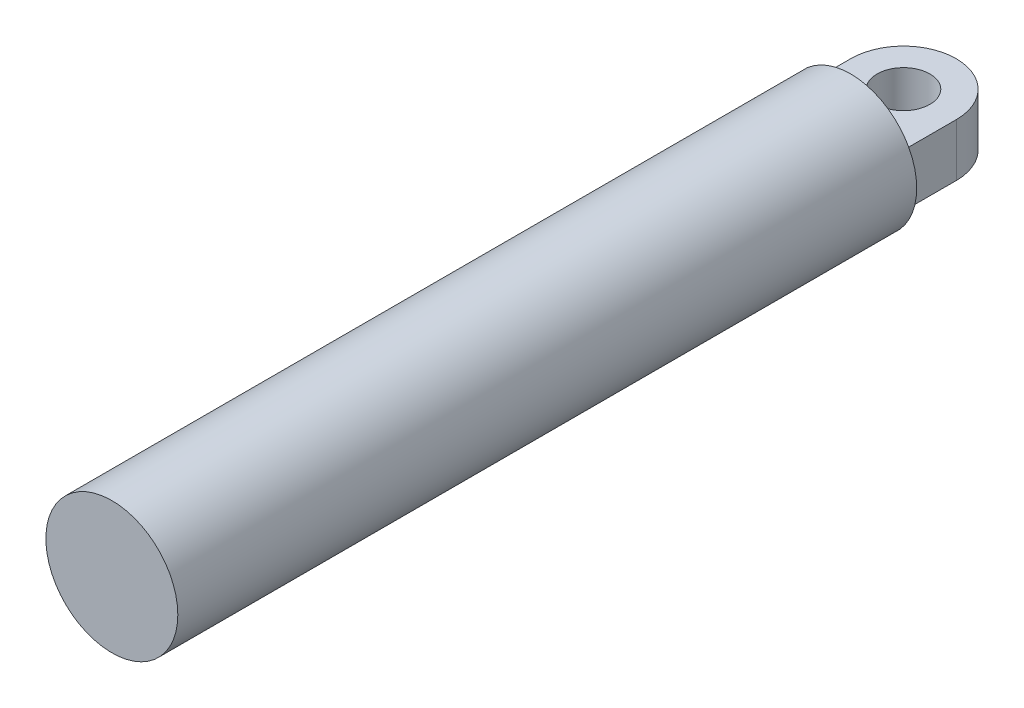
ISO-10303-21;
HEADER;
FILE_DESCRIPTION(('STEP AP214'),'2;1');
FILE_NAME('part.step','',(''),(''),'','','');
FILE_SCHEMA(('AUTOMOTIVE_DESIGN { 1 0 10303 214 1 1 1 1 }'));
ENDSEC;
DATA;
#1=APPLICATION_CONTEXT('core data for automotive mechanical design processes');
#2=APPLICATION_PROTOCOL_DEFINITION('international standard','automotive_design',2000,#1);
#3=PRODUCT_CONTEXT('',#1,'mechanical');
#4=PRODUCT('Part','Part','',(#3));
#5=PRODUCT_RELATED_PRODUCT_CATEGORY('part','',(#4));
#6=PRODUCT_DEFINITION_FORMATION('','',#4);
#7=PRODUCT_DEFINITION_CONTEXT('part definition',#1,'design');
#8=PRODUCT_DEFINITION('design','',#6,#7);
#9=PRODUCT_DEFINITION_SHAPE('','',#8);
#10=(LENGTH_UNIT() NAMED_UNIT(*) SI_UNIT(.MILLI.,.METRE.));
#11=(NAMED_UNIT(*) PLANE_ANGLE_UNIT() SI_UNIT($,.RADIAN.));
#12=(NAMED_UNIT(*) SI_UNIT($,.STERADIAN.) SOLID_ANGLE_UNIT());
#13=UNCERTAINTY_MEASURE_WITH_UNIT(LENGTH_MEASURE(1.E-05),#10,'distance_accuracy_value','');
#14=(GEOMETRIC_REPRESENTATION_CONTEXT(3) GLOBAL_UNCERTAINTY_ASSIGNED_CONTEXT((#13)) GLOBAL_UNIT_ASSIGNED_CONTEXT((#10,
#11,#12)) REPRESENTATION_CONTEXT('',''));
#15=CARTESIAN_POINT('',(0.,0.,0.));
#16=DIRECTION('',(0.,0.,1.));
#17=DIRECTION('',(1.,0.,0.));
#18=AXIS2_PLACEMENT_3D('',#15,#16,#17);
#19=CARTESIAN_POINT('',(0.,10.,-320.));
#20=DIRECTION('',(0.,1.,0.));
#21=DIRECTION('',(0.,0.,1.));
#22=AXIS2_PLACEMENT_3D('',#19,#20,#21);
#23=PLANE('',#22);
#24=CARTESIAN_POINT('',(0.,10.,-300.));
#25=DIRECTION('',(0.,1.,0.));
#26=DIRECTION('',(0.,0.,1.));
#27=AXIS2_PLACEMENT_3D('',#24,#25,#26);
#28=CIRCLE('',#27,10.);
#29=CARTESIAN_POINT('',(0.,10.,-290.));
#30=VERTEX_POINT('',#29);
#31=EDGE_CURVE('E185',#30,#30,#28,.T.);
#32=ORIENTED_EDGE('',*,*,#31,.F.);
#33=EDGE_LOOP('',(#32));
#34=FACE_BOUND('',#33,.T.);
#35=DIRECTION('',(0.,0.,1.));
#36=VECTOR('',#35,1.);
#37=CARTESIAN_POINT('',(20.,10.,-320.));
#38=LINE('',#37,#36);
#39=CARTESIAN_POINT('',(20.,10.,-300.));
#40=VERTEX_POINT('',#39);
#41=CARTESIAN_POINT('',(20.,10.,-280.));
#42=VERTEX_POINT('',#41);
#43=EDGE_CURVE('E140',#40,#42,#38,.T.);
#44=ORIENTED_EDGE('',*,*,#43,.F.);
#45=CARTESIAN_POINT('',(0.,10.,-300.));
#46=DIRECTION('',(0.,1.,0.));
#47=DIRECTION('',(0.,0.,1.));
#48=AXIS2_PLACEMENT_3D('',#45,#46,#47);
#49=CIRCLE('',#48,20.);
#50=CARTESIAN_POINT('',(-20.,10.,-300.));
#51=VERTEX_POINT('',#50);
#52=EDGE_CURVE('E129',#40,#51,#49,.T.);
#53=ORIENTED_EDGE('',*,*,#52,.T.);
#54=DIRECTION('',(0.,0.,1.));
#55=VECTOR('',#54,1.);
#56=CARTESIAN_POINT('',(-20.,10.,-320.));
#57=LINE('',#56,#55);
#58=CARTESIAN_POINT('',(-20.,10.,-280.));
#59=VERTEX_POINT('',#58);
#60=EDGE_CURVE('E94',#51,#59,#57,.T.);
#61=ORIENTED_EDGE('',*,*,#60,.T.);
#62=DIRECTION('',(-1.,0.,0.));
#63=VECTOR('',#62,1.);
#64=CARTESIAN_POINT('',(0.,10.,-280.));
#65=LINE('',#64,#63);
#66=EDGE_CURVE('E171',#42,#59,#65,.T.);
#67=ORIENTED_EDGE('',*,*,#66,.F.);
#68=EDGE_LOOP('',(#44,#53,#61,#67));
#69=FACE_BOUND('',#68,.T.);
#70=ADVANCED_FACE('F77',(#34,#69),#23,.T.);
#71=CARTESIAN_POINT('',(0.,-10.,-320.));
#72=DIRECTION('',(0.,1.,0.));
#73=DIRECTION('',(0.,0.,1.));
#74=AXIS2_PLACEMENT_3D('',#71,#72,#73);
#75=PLANE('',#74);
#76=CARTESIAN_POINT('',(0.,-10.,-300.));
#77=DIRECTION('',(0.,1.,0.));
#78=DIRECTION('',(0.,0.,1.));
#79=AXIS2_PLACEMENT_3D('',#76,#77,#78);
#80=CIRCLE('',#79,10.);
#81=CARTESIAN_POINT('',(0.,-10.,-290.));
#82=VERTEX_POINT('',#81);
#83=EDGE_CURVE('E81',#82,#82,#80,.T.);
#84=ORIENTED_EDGE('',*,*,#83,.T.);
#85=EDGE_LOOP('',(#84));
#86=FACE_BOUND('',#85,.T.);
#87=CARTESIAN_POINT('',(0.,-10.,-300.));
#88=DIRECTION('',(0.,1.,0.));
#89=DIRECTION('',(0.,0.,1.));
#90=AXIS2_PLACEMENT_3D('',#87,#88,#89);
#91=CIRCLE('',#90,20.);
#92=CARTESIAN_POINT('',(20.,-10.,-300.));
#93=VERTEX_POINT('',#92);
#94=CARTESIAN_POINT('',(-20.,-10.,-300.));
#95=VERTEX_POINT('',#94);
#96=EDGE_CURVE('E121',#93,#95,#91,.T.);
#97=ORIENTED_EDGE('',*,*,#96,.F.);
#98=DIRECTION('',(0.,0.,1.));
#99=VECTOR('',#98,1.);
#100=CARTESIAN_POINT('',(20.,-10.,-320.));
#101=LINE('',#100,#99);
#102=CARTESIAN_POINT('',(20.,-10.,-280.));
#103=VERTEX_POINT('',#102);
#104=EDGE_CURVE('E125',#93,#103,#101,.T.);
#105=ORIENTED_EDGE('',*,*,#104,.T.);
#106=DIRECTION('',(-1.,0.,0.));
#107=VECTOR('',#106,1.);
#108=CARTESIAN_POINT('',(0.,-10.,-280.));
#109=LINE('',#108,#107);
#110=CARTESIAN_POINT('',(-20.,-10.,-280.));
#111=VERTEX_POINT('',#110);
#112=EDGE_CURVE('E145',#103,#111,#109,.T.);
#113=ORIENTED_EDGE('',*,*,#112,.T.);
#114=DIRECTION('',(0.,0.,1.));
#115=VECTOR('',#114,1.);
#116=CARTESIAN_POINT('',(-20.,-10.,-320.));
#117=LINE('',#116,#115);
#118=EDGE_CURVE('E101',#95,#111,#117,.T.);
#119=ORIENTED_EDGE('',*,*,#118,.F.);
#120=EDGE_LOOP('',(#97,#105,#113,#119));
#121=FACE_BOUND('',#120,.T.);
#122=ADVANCED_FACE('F123',(#86,#121),#75,.F.);
#123=CARTESIAN_POINT('',(0.,0.,-280.));
#124=DIRECTION('',(0.,0.,-1.));
#125=DIRECTION('',(-1.,0.,0.));
#126=AXIS2_PLACEMENT_3D('',#123,#124,#125);
#127=PLANE('',#126);
#128=CARTESIAN_POINT('',(0.,0.,-280.));
#129=DIRECTION('',(0.,0.,-1.));
#130=DIRECTION('',(-1.,0.,0.));
#131=AXIS2_PLACEMENT_3D('',#128,#129,#130);
#132=CIRCLE('',#131,25.);
#133=CARTESIAN_POINT('',(-25.,0.,-280.));
#134=VERTEX_POINT('',#133);
#135=EDGE_CURVE('E151',#134,#134,#132,.T.);
#136=ORIENTED_EDGE('',*,*,#135,.T.);
#137=EDGE_LOOP('',(#136));
#138=FACE_BOUND('',#137,.T.);
#139=ORIENTED_EDGE('',*,*,#66,.T.);
#140=DIRECTION('',(0.,-1.,0.));
#141=VECTOR('',#140,1.);
#142=CARTESIAN_POINT('',(-20.,0.,-280.));
#143=LINE('',#142,#141);
#144=EDGE_CURVE('E172',#59,#111,#143,.T.);
#145=ORIENTED_EDGE('',*,*,#144,.T.);
#146=ORIENTED_EDGE('',*,*,#112,.F.);
#147=DIRECTION('',(0.,-1.,0.));
#148=VECTOR('',#147,1.);
#149=CARTESIAN_POINT('',(20.,0.,-280.));
#150=LINE('',#149,#148);
#151=EDGE_CURVE('E137',#42,#103,#150,.T.);
#152=ORIENTED_EDGE('',*,*,#151,.F.);
#153=EDGE_LOOP('',(#139,#145,#146,#152));
#154=FACE_BOUND('',#153,.T.);
#155=ADVANCED_FACE('F163',(#138,#154),#127,.T.);
#156=CARTESIAN_POINT('',(0.,0.,-30.));
#157=DIRECTION('',(0.,0.,1.));
#158=DIRECTION('',(1.,0.,0.));
#159=AXIS2_PLACEMENT_3D('',#156,#157,#158);
#160=CYLINDRICAL_SURFACE('',#159,25.);
#161=CARTESIAN_POINT('',(0.,0.,0.));
#162=DIRECTION('',(0.,0.,1.));
#163=DIRECTION('',(1.,0.,0.));
#164=AXIS2_PLACEMENT_3D('',#161,#162,#163);
#165=CIRCLE('',#164,25.);
#166=CARTESIAN_POINT('',(25.,0.,0.));
#167=VERTEX_POINT('',#166);
#168=EDGE_CURVE('E87',#167,#167,#165,.T.);
#169=ORIENTED_EDGE('',*,*,#168,.F.);
#170=EDGE_LOOP('',(#169));
#171=FACE_BOUND('',#170,.T.);
#172=ORIENTED_EDGE('',*,*,#135,.F.);
#173=EDGE_LOOP('',(#172));
#174=FACE_BOUND('',#173,.T.);
#175=ADVANCED_FACE('F79',(#171,#174),#160,.T.);
#176=CARTESIAN_POINT('',(0.,0.,0.));
#177=DIRECTION('',(0.,0.,1.));
#178=DIRECTION('',(1.,0.,0.));
#179=AXIS2_PLACEMENT_3D('',#176,#177,#178);
#180=PLANE('',#179);
#181=ORIENTED_EDGE('',*,*,#168,.T.);
#182=EDGE_LOOP('',(#181));
#183=FACE_BOUND('',#182,.T.);
#184=ADVANCED_FACE('F159',(#183),#180,.T.);
#185=CARTESIAN_POINT('',(-20.,0.,-320.));
#186=DIRECTION('',(-1.,0.,0.));
#187=DIRECTION('',(0.,0.,1.));
#188=AXIS2_PLACEMENT_3D('',#185,#186,#187);
#189=PLANE('',#188);
#190=DIRECTION('',(0.,1.,0.));
#191=VECTOR('',#190,1.);
#192=CARTESIAN_POINT('',(-20.,-25.,-300.));
#193=LINE('',#192,#191);
#194=EDGE_CURVE('E130',#95,#51,#193,.T.);
#195=ORIENTED_EDGE('',*,*,#194,.F.);
#196=ORIENTED_EDGE('',*,*,#118,.T.);
#197=ORIENTED_EDGE('',*,*,#144,.F.);
#198=ORIENTED_EDGE('',*,*,#60,.F.);
#199=EDGE_LOOP('',(#195,#196,#197,#198));
#200=FACE_BOUND('',#199,.T.);
#201=ADVANCED_FACE('F211',(#200),#189,.T.);
#202=CARTESIAN_POINT('',(20.,0.,-320.));
#203=DIRECTION('',(-1.,0.,0.));
#204=DIRECTION('',(0.,0.,1.));
#205=AXIS2_PLACEMENT_3D('',#202,#203,#204);
#206=PLANE('',#205);
#207=ORIENTED_EDGE('',*,*,#104,.F.);
#208=DIRECTION('',(0.,1.,0.));
#209=VECTOR('',#208,1.);
#210=CARTESIAN_POINT('',(20.,-25.,-300.));
#211=LINE('',#210,#209);
#212=EDGE_CURVE('E12',#93,#40,#211,.T.);
#213=ORIENTED_EDGE('',*,*,#212,.T.);
#214=ORIENTED_EDGE('',*,*,#43,.T.);
#215=ORIENTED_EDGE('',*,*,#151,.T.);
#216=EDGE_LOOP('',(#207,#213,#214,#215));
#217=FACE_BOUND('',#216,.T.);
#218=ADVANCED_FACE('F135',(#217),#206,.F.);
#219=CARTESIAN_POINT('',(0.,-25.,-300.));
#220=DIRECTION('',(0.,1.,0.));
#221=DIRECTION('',(0.,0.,1.));
#222=AXIS2_PLACEMENT_3D('',#219,#220,#221);
#223=CYLINDRICAL_SURFACE('',#222,20.);
#224=ORIENTED_EDGE('',*,*,#52,.F.);
#225=ORIENTED_EDGE('',*,*,#212,.F.);
#226=ORIENTED_EDGE('',*,*,#96,.T.);
#227=ORIENTED_EDGE('',*,*,#194,.T.);
#228=EDGE_LOOP('',(#224,#225,#226,#227));
#229=FACE_BOUND('',#228,.T.);
#230=ADVANCED_FACE('F132',(#229),#223,.T.);
#231=CARTESIAN_POINT('',(0.,-25.,-300.));
#232=DIRECTION('',(0.,1.,0.));
#233=DIRECTION('',(0.,0.,1.));
#234=AXIS2_PLACEMENT_3D('',#231,#232,#233);
#235=CYLINDRICAL_SURFACE('',#234,10.);
#236=ORIENTED_EDGE('',*,*,#31,.T.);
#237=EDGE_LOOP('',(#236));
#238=FACE_BOUND('',#237,.T.);
#239=ORIENTED_EDGE('',*,*,#83,.F.);
#240=EDGE_LOOP('',(#239));
#241=FACE_BOUND('',#240,.T.);
#242=ADVANCED_FACE('F195',(#238,#241),#235,.F.);
#243=CLOSED_SHELL('',(#70,#122,#155,#175,#184,#201,#218,#230,#242));
#244=MANIFOLD_SOLID_BREP('B2',#243);
#245=ADVANCED_BREP_SHAPE_REPRESENTATION('',(#18,#244),#14);
#246=SHAPE_DEFINITION_REPRESENTATION(#9,#245);
ENDSEC;
END-ISO-10303-21;
